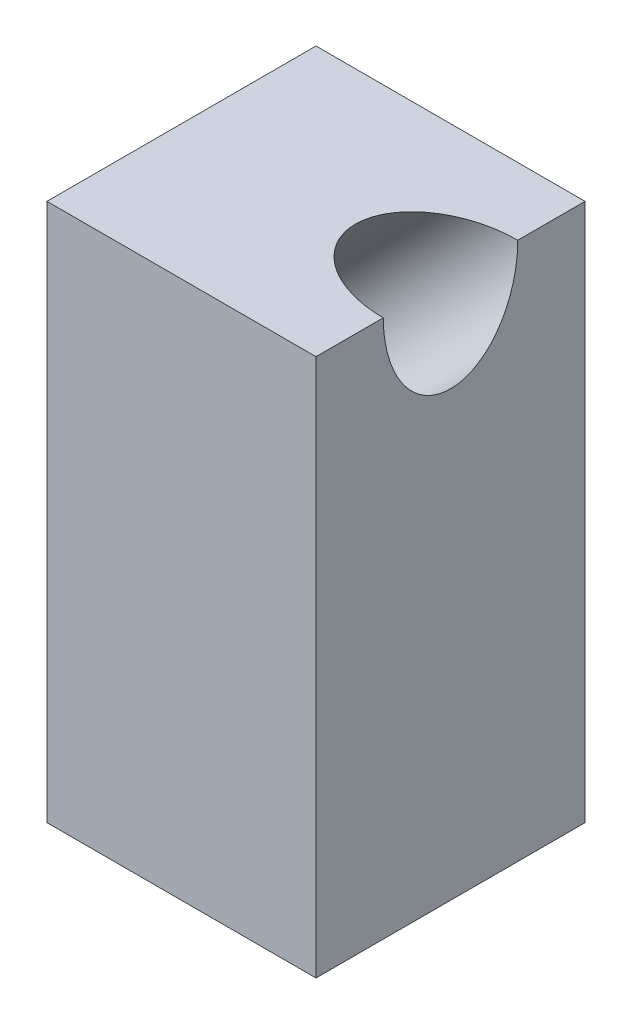
ISO-10303-21;
HEADER;
FILE_DESCRIPTION(('STEP AP214'),'2;1');
FILE_NAME('part.step','',(''),(''),'','','');
FILE_SCHEMA(('AUTOMOTIVE_DESIGN { 1 0 10303 214 1 1 1 1 }'));
ENDSEC;
DATA;
#1=APPLICATION_CONTEXT('core data for automotive mechanical design processes');
#2=APPLICATION_PROTOCOL_DEFINITION('international standard','automotive_design',2000,#1);
#3=PRODUCT_CONTEXT('',#1,'mechanical');
#4=PRODUCT('Part','Part','',(#3));
#5=PRODUCT_RELATED_PRODUCT_CATEGORY('part','',(#4));
#6=PRODUCT_DEFINITION_FORMATION('','',#4);
#7=PRODUCT_DEFINITION_CONTEXT('part definition',#1,'design');
#8=PRODUCT_DEFINITION('design','',#6,#7);
#9=PRODUCT_DEFINITION_SHAPE('','',#8);
#10=(LENGTH_UNIT() NAMED_UNIT(*) SI_UNIT(.MILLI.,.METRE.));
#11=(NAMED_UNIT(*) PLANE_ANGLE_UNIT() SI_UNIT($,.RADIAN.));
#12=(NAMED_UNIT(*) SI_UNIT($,.STERADIAN.) SOLID_ANGLE_UNIT());
#13=UNCERTAINTY_MEASURE_WITH_UNIT(LENGTH_MEASURE(1.E-05),#10,'distance_accuracy_value','');
#14=(GEOMETRIC_REPRESENTATION_CONTEXT(3) GLOBAL_UNCERTAINTY_ASSIGNED_CONTEXT((#13)) GLOBAL_UNIT_ASSIGNED_CONTEXT((#10,
#11,#12)) REPRESENTATION_CONTEXT('',''));
#15=CARTESIAN_POINT('',(0.,0.,0.));
#16=DIRECTION('',(0.,0.,1.));
#17=DIRECTION('',(1.,0.,0.));
#18=AXIS2_PLACEMENT_3D('',#15,#16,#17);
#19=CARTESIAN_POINT('',(0.,50.8,25.4));
#20=DIRECTION('',(0.,1.,0.));
#21=DIRECTION('',(0.,0.,1.));
#22=AXIS2_PLACEMENT_3D('',#19,#20,#21);
#23=PLANE('',#22);
#24=CARTESIAN_POINT('',(25.4,50.8,12.7));
#25=DIRECTION('',(0.,1.,0.));
#26=DIRECTION('',(1.,0.,0.));
#27=AXIS2_PLACEMENT_3D('',#24,#25,#26);
#28=ELLIPSE('',#27,8.98025612106916,6.35);
#29=CARTESIAN_POINT('',(25.4,50.8,6.35));
#30=VERTEX_POINT('',#29);
#31=CARTESIAN_POINT('',(25.4,50.8,19.05));
#32=VERTEX_POINT('',#31);
#33=EDGE_CURVE('E52',#30,#32,#28,.T.);
#34=ORIENTED_EDGE('',*,*,#33,.F.);
#35=DIRECTION('',(0.,0.,-1.));
#36=VECTOR('',#35,1.);
#37=CARTESIAN_POINT('',(25.4,50.8,25.4));
#38=LINE('',#37,#36);
#39=CARTESIAN_POINT('',(25.4,50.8,0.));
#40=VERTEX_POINT('',#39);
#41=EDGE_CURVE('E92',#30,#40,#38,.T.);
#42=ORIENTED_EDGE('',*,*,#41,.T.);
#43=DIRECTION('',(1.,0.,0.));
#44=VECTOR('',#43,1.);
#45=CARTESIAN_POINT('',(0.,50.8,0.));
#46=LINE('',#45,#44);
#47=CARTESIAN_POINT('',(0.,50.8,0.));
#48=VERTEX_POINT('',#47);
#49=EDGE_CURVE('E118',#48,#40,#46,.T.);
#50=ORIENTED_EDGE('',*,*,#49,.F.);
#51=DIRECTION('',(0.,0.,-1.));
#52=VECTOR('',#51,1.);
#53=CARTESIAN_POINT('',(0.,50.8,25.4));
#54=LINE('',#53,#52);
#55=CARTESIAN_POINT('',(0.,50.8,25.4));
#56=VERTEX_POINT('',#55);
#57=EDGE_CURVE('E46',#56,#48,#54,.T.);
#58=ORIENTED_EDGE('',*,*,#57,.F.);
#59=DIRECTION('',(1.,0.,0.));
#60=VECTOR('',#59,1.);
#61=CARTESIAN_POINT('',(0.,50.8,25.4));
#62=LINE('',#61,#60);
#63=CARTESIAN_POINT('',(25.4,50.8,25.4));
#64=VERTEX_POINT('',#63);
#65=EDGE_CURVE('E114',#56,#64,#62,.T.);
#66=ORIENTED_EDGE('',*,*,#65,.T.);
#67=EDGE_CURVE('E94',#64,#32,#38,.T.);
#68=ORIENTED_EDGE('',*,*,#67,.T.);
#69=EDGE_LOOP('',(#34,#42,#50,#58,#66,#68));
#70=FACE_BOUND('',#69,.T.);
#71=ADVANCED_FACE('F39',(#70),#23,.T.);
#72=CARTESIAN_POINT('',(0.,0.,25.4));
#73=DIRECTION('',(-1.,0.,0.));
#74=DIRECTION('',(0.,0.,1.));
#75=AXIS2_PLACEMENT_3D('',#72,#73,#74);
#76=PLANE('',#75);
#77=CARTESIAN_POINT('',(0.,25.4,12.7));
#78=DIRECTION('',(-1.,0.,0.));
#79=DIRECTION('',(0.,1.,0.));
#80=AXIS2_PLACEMENT_3D('',#77,#78,#79);
#81=ELLIPSE('',#80,8.98025612106916,6.35);
#82=CARTESIAN_POINT('',(0.,34.3802561210692,12.7));
#83=VERTEX_POINT('',#82);
#84=EDGE_CURVE('E95',#83,#83,#81,.T.);
#85=ORIENTED_EDGE('',*,*,#84,.F.);
#86=EDGE_LOOP('',(#85));
#87=FACE_BOUND('',#86,.T.);
#88=DIRECTION('',(0.,1.,0.));
#89=VECTOR('',#88,1.);
#90=CARTESIAN_POINT('',(0.,0.,0.));
#91=LINE('',#90,#89);
#92=CARTESIAN_POINT('',(0.,0.,0.));
#93=VERTEX_POINT('',#92);
#94=EDGE_CURVE('E111',#93,#48,#91,.T.);
#95=ORIENTED_EDGE('',*,*,#94,.F.);
#96=DIRECTION('',(0.,0.,-1.));
#97=VECTOR('',#96,1.);
#98=CARTESIAN_POINT('',(0.,0.,25.4));
#99=LINE('',#98,#97);
#100=CARTESIAN_POINT('',(0.,0.,25.4));
#101=VERTEX_POINT('',#100);
#102=EDGE_CURVE('E108',#101,#93,#99,.T.);
#103=ORIENTED_EDGE('',*,*,#102,.F.);
#104=DIRECTION('',(0.,1.,0.));
#105=VECTOR('',#104,1.);
#106=CARTESIAN_POINT('',(0.,0.,25.4));
#107=LINE('',#106,#105);
#108=EDGE_CURVE('E102',#101,#56,#107,.T.);
#109=ORIENTED_EDGE('',*,*,#108,.T.);
#110=ORIENTED_EDGE('',*,*,#57,.T.);
#111=EDGE_LOOP('',(#95,#103,#109,#110));
#112=FACE_BOUND('',#111,.T.);
#113=ADVANCED_FACE('F127',(#87,#112),#76,.T.);
#114=CARTESIAN_POINT('',(0.,0.,25.4));
#115=DIRECTION('',(0.,1.,0.));
#116=DIRECTION('',(0.,0.,1.));
#117=AXIS2_PLACEMENT_3D('',#114,#115,#116);
#118=PLANE('',#117);
#119=DIRECTION('',(1.,0.,0.));
#120=VECTOR('',#119,1.);
#121=CARTESIAN_POINT('',(0.,0.,0.));
#122=LINE('',#121,#120);
#123=CARTESIAN_POINT('',(25.4,0.,0.));
#124=VERTEX_POINT('',#123);
#125=EDGE_CURVE('E115',#93,#124,#122,.T.);
#126=ORIENTED_EDGE('',*,*,#125,.T.);
#127=DIRECTION('',(0.,0.,-1.));
#128=VECTOR('',#127,1.);
#129=CARTESIAN_POINT('',(25.4,0.,25.4));
#130=LINE('',#129,#128);
#131=CARTESIAN_POINT('',(25.4,0.,25.4));
#132=VERTEX_POINT('',#131);
#133=EDGE_CURVE('E103',#132,#124,#130,.T.);
#134=ORIENTED_EDGE('',*,*,#133,.F.);
#135=DIRECTION('',(1.,0.,0.));
#136=VECTOR('',#135,1.);
#137=CARTESIAN_POINT('',(0.,0.,25.4));
#138=LINE('',#137,#136);
#139=EDGE_CURVE('E104',#101,#132,#138,.T.);
#140=ORIENTED_EDGE('',*,*,#139,.F.);
#141=ORIENTED_EDGE('',*,*,#102,.T.);
#142=EDGE_LOOP('',(#126,#134,#140,#141));
#143=FACE_BOUND('',#142,.T.);
#144=ADVANCED_FACE('F129',(#143),#118,.F.);
#145=CARTESIAN_POINT('',(25.4,0.,25.4));
#146=DIRECTION('',(-1.,0.,0.));
#147=DIRECTION('',(0.,0.,1.));
#148=AXIS2_PLACEMENT_3D('',#145,#146,#147);
#149=PLANE('',#148);
#150=ORIENTED_EDGE('',*,*,#41,.F.);
#151=CARTESIAN_POINT('',(25.4,50.8,12.7));
#152=DIRECTION('',(-1.,0.,0.));
#153=DIRECTION('',(0.,1.,0.));
#154=AXIS2_PLACEMENT_3D('',#151,#152,#153);
#155=ELLIPSE('',#154,8.98025612106916,6.35);
#156=EDGE_CURVE('E11',#30,#32,#155,.T.);
#157=ORIENTED_EDGE('',*,*,#156,.T.);
#158=ORIENTED_EDGE('',*,*,#67,.F.);
#159=DIRECTION('',(0.,1.,0.));
#160=VECTOR('',#159,1.);
#161=CARTESIAN_POINT('',(25.4,0.,25.4));
#162=LINE('',#161,#160);
#163=EDGE_CURVE('E85',#132,#64,#162,.T.);
#164=ORIENTED_EDGE('',*,*,#163,.F.);
#165=ORIENTED_EDGE('',*,*,#133,.T.);
#166=DIRECTION('',(0.,1.,0.));
#167=VECTOR('',#166,1.);
#168=CARTESIAN_POINT('',(25.4,0.,0.));
#169=LINE('',#168,#167);
#170=EDGE_CURVE('E100',#124,#40,#169,.T.);
#171=ORIENTED_EDGE('',*,*,#170,.T.);
#172=EDGE_LOOP('',(#150,#157,#158,#164,#165,#171));
#173=FACE_BOUND('',#172,.T.);
#174=ADVANCED_FACE('F97',(#173),#149,.F.);
#175=CARTESIAN_POINT('',(0.,0.,25.4));
#176=DIRECTION('',(0.,0.,1.));
#177=DIRECTION('',(1.,0.,0.));
#178=AXIS2_PLACEMENT_3D('',#175,#176,#177);
#179=PLANE('',#178);
#180=ORIENTED_EDGE('',*,*,#65,.F.);
#181=ORIENTED_EDGE('',*,*,#108,.F.);
#182=ORIENTED_EDGE('',*,*,#139,.T.);
#183=ORIENTED_EDGE('',*,*,#163,.T.);
#184=EDGE_LOOP('',(#180,#181,#182,#183));
#185=FACE_BOUND('',#184,.T.);
#186=ADVANCED_FACE('F138',(#185),#179,.T.);
#187=CARTESIAN_POINT('',(0.,0.,0.));
#188=DIRECTION('',(0.,0.,1.));
#189=DIRECTION('',(1.,0.,0.));
#190=AXIS2_PLACEMENT_3D('',#187,#188,#189);
#191=PLANE('',#190);
#192=ORIENTED_EDGE('',*,*,#49,.T.);
#193=ORIENTED_EDGE('',*,*,#170,.F.);
#194=ORIENTED_EDGE('',*,*,#125,.F.);
#195=ORIENTED_EDGE('',*,*,#94,.T.);
#196=EDGE_LOOP('',(#192,#193,#194,#195));
#197=FACE_BOUND('',#196,.T.);
#198=ADVANCED_FACE('F134',(#197),#191,.F.);
#199=CARTESIAN_POINT('',(-10.5210244842766,14.8789755157234,12.7));
#200=DIRECTION('',(0.707106781186547,0.707106781186548,0.));
#201=DIRECTION('',(-0.707106781186548,0.707106781186547,0.));
#202=AXIS2_PLACEMENT_3D('',#199,#200,#201);
#203=CYLINDRICAL_SURFACE('',#202,6.35);
#204=ORIENTED_EDGE('',*,*,#84,.T.);
#205=EDGE_LOOP('',(#204));
#206=FACE_BOUND('',#205,.T.);
#207=ORIENTED_EDGE('',*,*,#33,.T.);
#208=ORIENTED_EDGE('',*,*,#156,.F.);
#209=EDGE_LOOP('',(#207,#208));
#210=FACE_BOUND('',#209,.T.);
#211=ADVANCED_FACE('F88',(#206,#210),#203,.F.);
#212=CLOSED_SHELL('',(#71,#113,#144,#174,#186,#198,#211));
#213=MANIFOLD_SOLID_BREP('B2',#212);
#214=ADVANCED_BREP_SHAPE_REPRESENTATION('',(#18,#213),#14);
#215=SHAPE_DEFINITION_REPRESENTATION(#9,#214);
ENDSEC;
END-ISO-10303-21;
